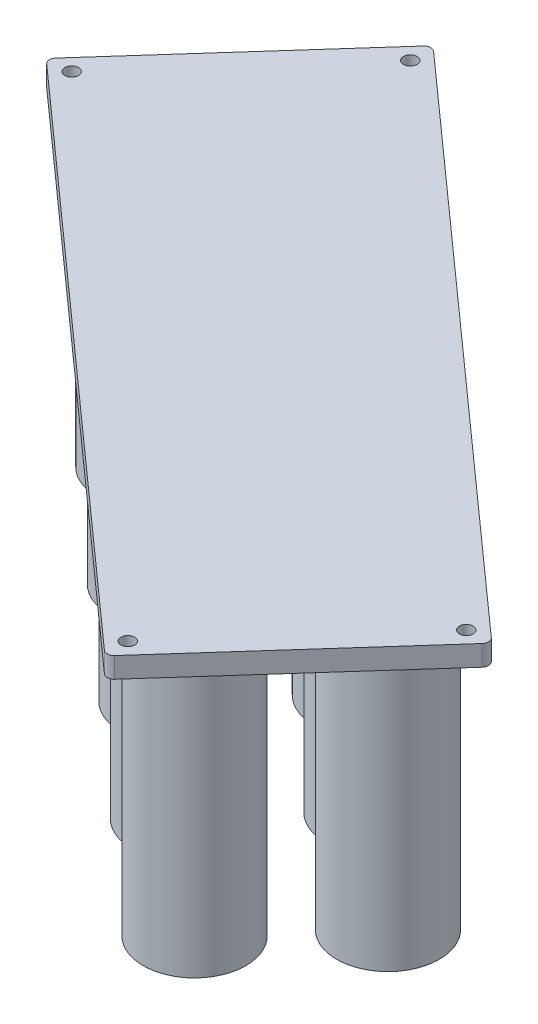
ISO-10303-21;
HEADER;
FILE_DESCRIPTION(('STEP AP214'),'2;1');
FILE_NAME('part.step','',(''),(''),'','','');
FILE_SCHEMA(('AUTOMOTIVE_DESIGN { 1 0 10303 214 1 1 1 1 }'));
ENDSEC;
DATA;
#1=APPLICATION_CONTEXT('core data for automotive mechanical design processes');
#2=APPLICATION_PROTOCOL_DEFINITION('international standard','automotive_design',2000,#1);
#3=PRODUCT_CONTEXT('',#1,'mechanical');
#4=PRODUCT('Part','Part','',(#3));
#5=PRODUCT_RELATED_PRODUCT_CATEGORY('part','',(#4));
#6=PRODUCT_DEFINITION_FORMATION('','',#4);
#7=PRODUCT_DEFINITION_CONTEXT('part definition',#1,'design');
#8=PRODUCT_DEFINITION('design','',#6,#7);
#9=PRODUCT_DEFINITION_SHAPE('','',#8);
#10=(LENGTH_UNIT() NAMED_UNIT(*) SI_UNIT(.MILLI.,.METRE.));
#11=(NAMED_UNIT(*) PLANE_ANGLE_UNIT() SI_UNIT($,.RADIAN.));
#12=(NAMED_UNIT(*) SI_UNIT($,.STERADIAN.) SOLID_ANGLE_UNIT());
#13=UNCERTAINTY_MEASURE_WITH_UNIT(LENGTH_MEASURE(1.E-05),#10,'distance_accuracy_value','');
#14=(GEOMETRIC_REPRESENTATION_CONTEXT(3) GLOBAL_UNCERTAINTY_ASSIGNED_CONTEXT((#13)) GLOBAL_UNIT_ASSIGNED_CONTEXT((#10,
#11,#12)) REPRESENTATION_CONTEXT('',''));
#15=CARTESIAN_POINT('',(0.,0.,0.));
#16=DIRECTION('',(0.,0.,1.));
#17=DIRECTION('',(1.,0.,0.));
#18=AXIS2_PLACEMENT_3D('',#15,#16,#17);
#19=CARTESIAN_POINT('',(43.2150354990466,-6.69382578946883,113.154126075941));
#20=DIRECTION('',(-0.665833640390477,0.,0.746100236780799));
#21=DIRECTION('',(0.746100236780799,0.,0.665833640390477));
#22=AXIS2_PLACEMENT_3D('',#19,#20,#21);
#23=PLANE('',#22);
#24=DIRECTION('',(-0.746100236780799,0.,-0.665833640390477));
#25=VECTOR('',#24,1.);
#26=CARTESIAN_POINT('',(43.2150354990466,-9.69382578946883,113.154126075941));
#27=LINE('',#26,#25);
#28=CARTESIAN_POINT('',(42.4689352622658,-9.69382578946883,112.48829243555));
#29=VERTEX_POINT('',#28);
#30=CARTESIAN_POINT('',(-35.8715895997181,-9.69382578946883,42.5757601945502));
#31=VERTEX_POINT('',#30);
#32=EDGE_CURVE('E168',#29,#31,#27,.T.);
#33=ORIENTED_EDGE('',*,*,#32,.F.);
#34=DIRECTION('',(0.,-1.,0.));
#35=VECTOR('',#34,1.);
#36=CARTESIAN_POINT('',(42.4689352622658,-6.69382578946883,112.48829243555));
#37=LINE('',#36,#35);
#38=CARTESIAN_POINT('',(42.4689352622658,-6.69382578946883,112.48829243555));
#39=VERTEX_POINT('',#38);
#40=EDGE_CURVE('E144',#29,#39,#37,.F.);
#41=ORIENTED_EDGE('',*,*,#40,.T.);
#42=DIRECTION('',(-0.746100236780799,0.,-0.665833640390477));
#43=VECTOR('',#42,1.);
#44=CARTESIAN_POINT('',(43.2150354990466,-6.69382578946883,113.154126075941));
#45=LINE('',#44,#43);
#46=CARTESIAN_POINT('',(-35.8715895997181,-6.69382578946883,42.5757601945502));
#47=VERTEX_POINT('',#46);
#48=EDGE_CURVE('E124',#39,#47,#45,.T.);
#49=ORIENTED_EDGE('',*,*,#48,.T.);
#50=DIRECTION('',(0.,-1.,0.));
#51=VECTOR('',#50,1.);
#52=CARTESIAN_POINT('',(-35.8715895997181,-6.69382578946883,42.5757601945502));
#53=LINE('',#52,#51);
#54=EDGE_CURVE('E141',#47,#31,#53,.T.);
#55=ORIENTED_EDGE('',*,*,#54,.T.);
#56=EDGE_LOOP('',(#33,#41,#49,#55));
#57=FACE_BOUND('',#56,.T.);
#58=ADVANCED_FACE('F37',(#57),#23,.T.);
#59=CARTESIAN_POINT('',(69.8483811146657,-6.69382578946883,83.3101166047088));
#60=DIRECTION('',(0.746100236780799,0.,0.665833640390477));
#61=DIRECTION('',(0.665833640390477,0.,-0.746100236780799));
#62=AXIS2_PLACEMENT_3D('',#59,#60,#61);
#63=PLANE('',#62);
#64=DIRECTION('',(-0.665833640390477,0.,0.746100236780799));
#65=VECTOR('',#64,1.);
#66=CARTESIAN_POINT('',(69.8483811146657,-6.69382578946883,83.3101166047088));
#67=LINE('',#66,#65);
#68=CARTESIAN_POINT('',(69.1825474742752,-6.69382578946883,84.0562168414896));
#69=VERTEX_POINT('',#68);
#70=CARTESIAN_POINT('',(43.8808691394371,-6.69382578946883,112.40802583916));
#71=VERTEX_POINT('',#70);
#72=EDGE_CURVE('E160',#69,#71,#67,.T.);
#73=ORIENTED_EDGE('',*,*,#72,.T.);
#74=DIRECTION('',(0.,-1.,0.));
#75=VECTOR('',#74,1.);
#76=CARTESIAN_POINT('',(43.8808691394371,-6.69382578946883,112.40802583916));
#77=LINE('',#76,#75);
#78=CARTESIAN_POINT('',(43.8808691394371,-9.69382578946883,112.40802583916));
#79=VERTEX_POINT('',#78);
#80=EDGE_CURVE('E123',#71,#79,#77,.T.);
#81=ORIENTED_EDGE('',*,*,#80,.T.);
#82=DIRECTION('',(-0.665833640390477,0.,0.746100236780799));
#83=VECTOR('',#82,1.);
#84=CARTESIAN_POINT('',(69.8483811146657,-9.69382578946883,83.3101166047088));
#85=LINE('',#84,#83);
#86=CARTESIAN_POINT('',(69.1825474742752,-9.69382578946883,84.0562168414896));
#87=VERTEX_POINT('',#86);
#88=EDGE_CURVE('E106',#87,#79,#85,.T.);
#89=ORIENTED_EDGE('',*,*,#88,.F.);
#90=DIRECTION('',(0.,-1.,0.));
#91=VECTOR('',#90,1.);
#92=CARTESIAN_POINT('',(69.1825474742752,-6.69382578946883,84.0562168414896));
#93=LINE('',#92,#91);
#94=EDGE_CURVE('E120',#87,#69,#93,.F.);
#95=ORIENTED_EDGE('',*,*,#94,.T.);
#96=EDGE_LOOP('',(#73,#81,#89,#95));
#97=FACE_BOUND('',#96,.T.);
#98=ADVANCED_FACE('F119',(#97),#63,.T.);
#99=CARTESIAN_POINT('',(-9.98434422087984,-6.69382578946883,12.0659170829278));
#100=DIRECTION('',(0.665833640390477,0.,-0.746100236780799));
#101=DIRECTION('',(-0.746100236780799,0.,-0.665833640390477));
#102=AXIS2_PLACEMENT_3D('',#99,#100,#101);
#103=PLANE('',#102);
#104=DIRECTION('',(0.746100236780799,0.,0.665833640390477));
#105=VECTOR('',#104,1.);
#106=CARTESIAN_POINT('',(-9.98434422087984,-6.69382578946883,12.0659170829278));
#107=LINE('',#106,#105);
#108=CARTESIAN_POINT('',(-9.23824398409904,-6.69382578946883,12.7317507233182));
#109=VERTEX_POINT('',#108);
#110=CARTESIAN_POINT('',(69.1022808778849,-6.69382578946883,82.6442829643183));
#111=VERTEX_POINT('',#110);
#112=EDGE_CURVE('E159',#109,#111,#107,.T.);
#113=ORIENTED_EDGE('',*,*,#112,.T.);
#114=DIRECTION('',(0.,-1.,0.));
#115=VECTOR('',#114,1.);
#116=CARTESIAN_POINT('',(69.1022808778849,-6.69382578946883,82.6442829643184));
#117=LINE('',#116,#115);
#118=CARTESIAN_POINT('',(69.1022808778849,-9.69382578946883,82.6442829643183));
#119=VERTEX_POINT('',#118);
#120=EDGE_CURVE('E154',#111,#119,#117,.T.);
#121=ORIENTED_EDGE('',*,*,#120,.T.);
#122=DIRECTION('',(0.746100236780799,0.,0.665833640390477));
#123=VECTOR('',#122,1.);
#124=CARTESIAN_POINT('',(-9.98434422087984,-9.69382578946883,12.0659170829278));
#125=LINE('',#124,#123);
#126=CARTESIAN_POINT('',(-9.23824398409904,-9.69382578946883,12.7317507233182));
#127=VERTEX_POINT('',#126);
#128=EDGE_CURVE('E108',#127,#119,#125,.T.);
#129=ORIENTED_EDGE('',*,*,#128,.F.);
#130=DIRECTION('',(0.,-1.,0.));
#131=VECTOR('',#130,1.);
#132=CARTESIAN_POINT('',(-9.23824398409904,-6.69382578946883,12.7317507233182));
#133=LINE('',#132,#131);
#134=EDGE_CURVE('E152',#127,#109,#133,.F.);
#135=ORIENTED_EDGE('',*,*,#134,.T.);
#136=EDGE_LOOP('',(#113,#121,#129,#135));
#137=FACE_BOUND('',#136,.T.);
#138=ADVANCED_FACE('F157',(#137),#103,.T.);
#139=CARTESIAN_POINT('',(-36.6176898364989,-6.69382578946883,41.9099265541598));
#140=DIRECTION('',(-0.746100236780799,0.,-0.665833640390477));
#141=DIRECTION('',(-0.665833640390477,0.,0.746100236780799));
#142=AXIS2_PLACEMENT_3D('',#139,#140,#141);
#143=PLANE('',#142);
#144=DIRECTION('',(0.665833640390477,0.,-0.746100236780799));
#145=VECTOR('',#144,1.);
#146=CARTESIAN_POINT('',(-36.6176898364989,-6.69382578946883,41.9099265541598));
#147=LINE('',#146,#145);
#148=CARTESIAN_POINT('',(-35.9518561961085,-6.69382578946883,41.1638263173789));
#149=VERTEX_POINT('',#148);
#150=CARTESIAN_POINT('',(-10.6501778612703,-6.69382578946883,12.8120173197086));
#151=VERTEX_POINT('',#150);
#152=EDGE_CURVE('E161',#149,#151,#147,.T.);
#153=ORIENTED_EDGE('',*,*,#152,.T.);
#154=DIRECTION('',(0.,-1.,0.));
#155=VECTOR('',#154,1.);
#156=CARTESIAN_POINT('',(-10.6501778612703,-6.69382578946883,12.8120173197086));
#157=LINE('',#156,#155);
#158=CARTESIAN_POINT('',(-10.6501778612703,-9.69382578946883,12.8120173197086));
#159=VERTEX_POINT('',#158);
#160=EDGE_CURVE('E11',#151,#159,#157,.T.);
#161=ORIENTED_EDGE('',*,*,#160,.T.);
#162=DIRECTION('',(0.665833640390477,0.,-0.746100236780799));
#163=VECTOR('',#162,1.);
#164=CARTESIAN_POINT('',(-36.6176898364989,-9.69382578946883,41.9099265541598));
#165=LINE('',#164,#163);
#166=CARTESIAN_POINT('',(-35.9518561961085,-9.69382578946883,41.1638263173789));
#167=VERTEX_POINT('',#166);
#168=EDGE_CURVE('E171',#167,#159,#165,.T.);
#169=ORIENTED_EDGE('',*,*,#168,.F.);
#170=DIRECTION('',(0.,-1.,0.));
#171=VECTOR('',#170,1.);
#172=CARTESIAN_POINT('',(-35.9518561961085,-6.69382578946883,41.1638263173789));
#173=LINE('',#172,#171);
#174=EDGE_CURVE('E45',#167,#149,#173,.F.);
#175=ORIENTED_EDGE('',*,*,#174,.T.);
#176=EDGE_LOOP('',(#153,#161,#169,#175));
#177=FACE_BOUND('',#176,.T.);
#178=ADVANCED_FACE('F294',(#177),#143,.T.);
#179=CARTESIAN_POINT('',(0.,-6.69382578946883,0.));
#180=DIRECTION('',(0.,-1.,0.));
#181=DIRECTION('',(0.,0.,-1.));
#182=AXIS2_PLACEMENT_3D('',#179,#180,#181);
#183=PLANE('',#182);
#184=CARTESIAN_POINT('',(43.0143690080708,-6.69382578946883,109.624291383013));
#185=DIRECTION('',(0.,-1.,0.));
#186=DIRECTION('',(0.,0.,-1.));
#187=AXIS2_PLACEMENT_3D('',#184,#185,#186);
#188=CIRCLE('',#187,0.999999999999994);
#189=CARTESIAN_POINT('',(43.0143690080708,-6.69382578946883,108.624291383013));
#190=VERTEX_POINT('',#189);
#191=EDGE_CURVE('E266',#190,#190,#188,.T.);
#192=ORIENTED_EDGE('',*,*,#191,.T.);
#193=EDGE_LOOP('',(#192));
#194=FACE_BOUND('',#193,.T.);
#195=CARTESIAN_POINT('',(-9.78367772990404,-6.69382578946883,15.595751775856));
#196=DIRECTION('',(0.,-1.,0.));
#197=DIRECTION('',(0.,0.,-1.));
#198=AXIS2_PLACEMENT_3D('',#195,#196,#197);
#199=CIRCLE('',#198,0.999999999999992);
#200=CARTESIAN_POINT('',(-9.78367772990404,-6.69382578946883,14.595751775856));
#201=VERTEX_POINT('',#200);
#202=EDGE_CURVE('E272',#201,#201,#199,.T.);
#203=ORIENTED_EDGE('',*,*,#202,.T.);
#204=EDGE_LOOP('',(#203));
#205=FACE_BOUND('',#204,.T.);
#206=CARTESIAN_POINT('',(-33.0878551435707,-6.69382578946883,41.7092600631839));
#207=DIRECTION('',(0.,-1.,0.));
#208=DIRECTION('',(0.,0.,-1.));
#209=AXIS2_PLACEMENT_3D('',#206,#207,#208);
#210=CIRCLE('',#209,0.999999999999994);
#211=CARTESIAN_POINT('',(-33.0878551435707,-6.69382578946883,40.7092600631839));
#212=VERTEX_POINT('',#211);
#213=EDGE_CURVE('E278',#212,#212,#210,.T.);
#214=ORIENTED_EDGE('',*,*,#213,.T.);
#215=EDGE_LOOP('',(#214));
#216=FACE_BOUND('',#215,.T.);
#217=CARTESIAN_POINT('',(66.3185464217375,-6.69382578946883,83.5107830956846));
#218=DIRECTION('',(0.,-1.,0.));
#219=DIRECTION('',(0.,0.,-1.));
#220=AXIS2_PLACEMENT_3D('',#217,#218,#219);
#221=CIRCLE('',#220,0.999999999999987);
#222=CARTESIAN_POINT('',(66.3185464217375,-6.69382578946883,82.5107830956846));
#223=VERTEX_POINT('',#222);
#224=EDGE_CURVE('E172',#223,#223,#221,.T.);
#225=ORIENTED_EDGE('',*,*,#224,.T.);
#226=EDGE_LOOP('',(#225));
#227=FACE_BOUND('',#226,.T.);
#228=ORIENTED_EDGE('',*,*,#48,.F.);
#229=CARTESIAN_POINT('',(43.1347689026563,-6.69382578946883,111.74219219877));
#230=DIRECTION('',(0.,-1.,0.));
#231=DIRECTION('',(0.,0.,-1.));
#232=AXIS2_PLACEMENT_3D('',#229,#230,#231);
#233=CIRCLE('',#232,1.);
#234=EDGE_CURVE('E150',#39,#71,#233,.F.);
#235=ORIENTED_EDGE('',*,*,#234,.T.);
#236=ORIENTED_EDGE('',*,*,#72,.F.);
#237=CARTESIAN_POINT('',(68.4364472374944,-6.69382578946883,83.3903832010992));
#238=DIRECTION('',(0.,-1.,0.));
#239=DIRECTION('',(0.,0.,-1.));
#240=AXIS2_PLACEMENT_3D('',#237,#238,#239);
#241=CIRCLE('',#240,1.);
#242=EDGE_CURVE('E128',#69,#111,#241,.F.);
#243=ORIENTED_EDGE('',*,*,#242,.T.);
#244=ORIENTED_EDGE('',*,*,#112,.F.);
#245=CARTESIAN_POINT('',(-9.90407762448952,-6.69382578946883,13.477850960099));
#246=DIRECTION('',(0.,-1.,0.));
#247=DIRECTION('',(0.,0.,-1.));
#248=AXIS2_PLACEMENT_3D('',#245,#246,#247);
#249=CIRCLE('',#248,1.);
#250=EDGE_CURVE('E52',#109,#151,#249,.F.);
#251=ORIENTED_EDGE('',*,*,#250,.T.);
#252=ORIENTED_EDGE('',*,*,#152,.F.);
#253=CARTESIAN_POINT('',(-35.2057559593277,-6.69382578946883,41.8296599577694));
#254=DIRECTION('',(0.,-1.,0.));
#255=DIRECTION('',(0.,0.,-1.));
#256=AXIS2_PLACEMENT_3D('',#253,#254,#255);
#257=CIRCLE('',#256,1.);
#258=EDGE_CURVE('E146',#149,#47,#257,.F.);
#259=ORIENTED_EDGE('',*,*,#258,.T.);
#260=EDGE_LOOP('',(#228,#235,#236,#243,#244,#251,#252,#259));
#261=FACE_BOUND('',#260,.T.);
#262=ADVANCED_FACE('F207',(#194,#205,#216,#227,#261),#183,.F.);
#263=CARTESIAN_POINT('',(0.,-9.69382578946883,0.));
#264=DIRECTION('',(0.,-1.,0.));
#265=DIRECTION('',(0.,0.,-1.));
#266=AXIS2_PLACEMENT_3D('',#263,#264,#265);
#267=PLANE('',#266);
#268=CARTESIAN_POINT('',(43.0143690080708,-9.69382578946884,109.624291383013));
#269=DIRECTION('',(0.,-1.,0.));
#270=DIRECTION('',(0.,0.,-1.));
#271=AXIS2_PLACEMENT_3D('',#268,#269,#270);
#272=CIRCLE('',#271,0.999999999999994);
#273=CARTESIAN_POINT('',(43.0143690080708,-9.69382578946884,108.624291383013));
#274=VERTEX_POINT('',#273);
#275=EDGE_CURVE('E263',#274,#274,#272,.T.);
#276=ORIENTED_EDGE('',*,*,#275,.F.);
#277=EDGE_LOOP('',(#276));
#278=FACE_BOUND('',#277,.T.);
#279=CARTESIAN_POINT('',(-9.78367772990404,-9.69382578946884,15.595751775856));
#280=DIRECTION('',(0.,-1.,0.));
#281=DIRECTION('',(0.,0.,-1.));
#282=AXIS2_PLACEMENT_3D('',#279,#280,#281);
#283=CIRCLE('',#282,0.999999999999994);
#284=CARTESIAN_POINT('',(-9.78367772990404,-9.69382578946884,14.595751775856));
#285=VERTEX_POINT('',#284);
#286=EDGE_CURVE('E269',#285,#285,#283,.T.);
#287=ORIENTED_EDGE('',*,*,#286,.F.);
#288=EDGE_LOOP('',(#287));
#289=FACE_BOUND('',#288,.T.);
#290=CARTESIAN_POINT('',(-33.0878551435707,-9.69382578946884,41.7092600631839));
#291=DIRECTION('',(0.,-1.,0.));
#292=DIRECTION('',(0.,0.,-1.));
#293=AXIS2_PLACEMENT_3D('',#290,#291,#292);
#294=CIRCLE('',#293,0.999999999999994);
#295=CARTESIAN_POINT('',(-33.0878551435707,-9.69382578946884,40.7092600631839));
#296=VERTEX_POINT('',#295);
#297=EDGE_CURVE('E275',#296,#296,#294,.T.);
#298=ORIENTED_EDGE('',*,*,#297,.F.);
#299=EDGE_LOOP('',(#298));
#300=FACE_BOUND('',#299,.T.);
#301=CARTESIAN_POINT('',(66.3185464217375,-9.69382578946884,83.5107830956846));
#302=DIRECTION('',(0.,-1.,0.));
#303=DIRECTION('',(0.,0.,-1.));
#304=AXIS2_PLACEMENT_3D('',#301,#302,#303);
#305=CIRCLE('',#304,0.999999999999987);
#306=CARTESIAN_POINT('',(66.3185464217375,-9.69382578946884,82.5107830956846));
#307=VERTEX_POINT('',#306);
#308=EDGE_CURVE('E281',#307,#307,#305,.T.);
#309=ORIENTED_EDGE('',*,*,#308,.F.);
#310=EDGE_LOOP('',(#309));
#311=FACE_BOUND('',#310,.T.);
#312=CARTESIAN_POINT('',(-9.18167825697663,-9.69382578946883,26.1852558546405));
#313=DIRECTION('',(0.,-1.,0.));
#314=DIRECTION('',(0.,0.,-1.));
#315=AXIS2_PLACEMENT_3D('',#312,#313,#314);
#316=CIRCLE('',#315,7.49999999999999);
#317=CARTESIAN_POINT('',(-9.18167825697663,-9.69382578946883,18.6852558546406));
#318=VERTEX_POINT('',#317);
#319=EDGE_CURVE('E129',#318,#318,#316,.T.);
#320=ORIENTED_EDGE('',*,*,#319,.F.);
#321=EDGE_LOOP('',(#320));
#322=FACE_BOUND('',#321,.T.);
#323=CARTESIAN_POINT('',(6.48642671542016,-9.69382578946883,40.1677623028406));
#324=DIRECTION('',(0.,-1.,0.));
#325=DIRECTION('',(0.,0.,-1.));
#326=AXIS2_PLACEMENT_3D('',#323,#324,#325);
#327=CIRCLE('',#326,7.49999999999999);
#328=CARTESIAN_POINT('',(6.48642671542016,-9.69382578946883,32.6677623028406));
#329=VERTEX_POINT('',#328);
#330=EDGE_CURVE('E134',#329,#329,#327,.T.);
#331=ORIENTED_EDGE('',*,*,#330,.F.);
#332=EDGE_LOOP('',(#331));
#333=FACE_BOUND('',#332,.T.);
#334=CARTESIAN_POINT('',(22.1545316878169,-9.69382578946883,54.1502687510406));
#335=DIRECTION('',(0.,-1.,0.));
#336=DIRECTION('',(0.,0.,-1.));
#337=AXIS2_PLACEMENT_3D('',#334,#335,#336);
#338=CIRCLE('',#337,7.5);
#339=CARTESIAN_POINT('',(22.1545316878169,-9.69382578946883,46.6502687510406));
#340=VERTEX_POINT('',#339);
#341=EDGE_CURVE('E196',#340,#340,#338,.T.);
#342=ORIENTED_EDGE('',*,*,#341,.F.);
#343=EDGE_LOOP('',(#342));
#344=FACE_BOUND('',#343,.T.);
#345=CARTESIAN_POINT('',(-22.4983510647862,-9.69382578946883,41.1072605902565));
#346=DIRECTION('',(0.,-1.,0.));
#347=DIRECTION('',(0.,0.,-1.));
#348=AXIS2_PLACEMENT_3D('',#345,#346,#347);
#349=CIRCLE('',#348,7.49999999999999);
#350=CARTESIAN_POINT('',(-22.4983510647862,-9.69382578946883,33.6072605902565));
#351=VERTEX_POINT('',#350);
#352=EDGE_CURVE('E193',#351,#351,#349,.T.);
#353=ORIENTED_EDGE('',*,*,#352,.F.);
#354=EDGE_LOOP('',(#353));
#355=FACE_BOUND('',#354,.T.);
#356=CARTESIAN_POINT('',(-6.83024609238938,-9.69382578946883,55.0897670384565));
#357=DIRECTION('',(0.,-1.,0.));
#358=DIRECTION('',(0.,0.,-1.));
#359=AXIS2_PLACEMENT_3D('',#356,#357,#358);
#360=CIRCLE('',#359,7.49999999999999);
#361=CARTESIAN_POINT('',(-6.83024609238938,-9.69382578946883,47.5897670384566));
#362=VERTEX_POINT('',#361);
#363=EDGE_CURVE('E190',#362,#362,#360,.T.);
#364=ORIENTED_EDGE('',*,*,#363,.F.);
#365=EDGE_LOOP('',(#364));
#366=FACE_BOUND('',#365,.T.);
#367=CARTESIAN_POINT('',(8.8378588800074,-9.69382578946883,69.0722734866566));
#368=DIRECTION('',(0.,-1.,0.));
#369=DIRECTION('',(0.,0.,-1.));
#370=AXIS2_PLACEMENT_3D('',#367,#368,#369);
#371=CIRCLE('',#370,7.5);
#372=CARTESIAN_POINT('',(8.8378588800074,-9.69382578946883,61.5722734866566));
#373=VERTEX_POINT('',#372);
#374=EDGE_CURVE('E187',#373,#373,#371,.T.);
#375=ORIENTED_EDGE('',*,*,#374,.F.);
#376=EDGE_LOOP('',(#375));
#377=FACE_BOUND('',#376,.T.);
#378=CARTESIAN_POINT('',(53.4907416326105,-9.69382578946883,82.1152816474406));
#379=DIRECTION('',(0.,-1.,0.));
#380=DIRECTION('',(0.,0.,-1.));
#381=AXIS2_PLACEMENT_3D('',#378,#379,#380);
#382=CIRCLE('',#381,7.5);
#383=CARTESIAN_POINT('',(53.4907416326105,-9.69382578946883,74.6152816474406));
#384=VERTEX_POINT('',#383);
#385=EDGE_CURVE('E184',#384,#384,#382,.T.);
#386=ORIENTED_EDGE('',*,*,#385,.F.);
#387=EDGE_LOOP('',(#386));
#388=FACE_BOUND('',#387,.T.);
#389=CARTESIAN_POINT('',(40.174068824801,-9.69382578946883,97.0372863830566));
#390=DIRECTION('',(0.,-1.,0.));
#391=DIRECTION('',(0.,0.,-1.));
#392=AXIS2_PLACEMENT_3D('',#389,#390,#391);
#393=CIRCLE('',#392,7.5);
#394=CARTESIAN_POINT('',(40.174068824801,-9.69382578946883,89.5372863830566));
#395=VERTEX_POINT('',#394);
#396=EDGE_CURVE('E181',#395,#395,#393,.T.);
#397=ORIENTED_EDGE('',*,*,#396,.F.);
#398=EDGE_LOOP('',(#397));
#399=FACE_BOUND('',#398,.T.);
#400=CARTESIAN_POINT('',(24.5059638524042,-9.69382578946883,83.0547799348566));
#401=DIRECTION('',(0.,-1.,0.));
#402=DIRECTION('',(0.,0.,-1.));
#403=AXIS2_PLACEMENT_3D('',#400,#401,#402);
#404=CIRCLE('',#403,7.5);
#405=CARTESIAN_POINT('',(24.5059638524042,-9.69382578946883,75.5547799348566));
#406=VERTEX_POINT('',#405);
#407=EDGE_CURVE('E178',#406,#406,#404,.T.);
#408=ORIENTED_EDGE('',*,*,#407,.F.);
#409=EDGE_LOOP('',(#408));
#410=FACE_BOUND('',#409,.T.);
#411=CARTESIAN_POINT('',(37.8226366602137,-9.69382578946883,68.1327751992406));
#412=DIRECTION('',(0.,-1.,0.));
#413=DIRECTION('',(0.,0.,-1.));
#414=AXIS2_PLACEMENT_3D('',#411,#412,#413);
#415=CIRCLE('',#414,7.5);
#416=CARTESIAN_POINT('',(37.8226366602137,-9.69382578946883,60.6327751992406));
#417=VERTEX_POINT('',#416);
#418=EDGE_CURVE('E163',#417,#417,#415,.T.);
#419=ORIENTED_EDGE('',*,*,#418,.F.);
#420=EDGE_LOOP('',(#419));
#421=FACE_BOUND('',#420,.T.);
#422=ORIENTED_EDGE('',*,*,#88,.T.);
#423=CARTESIAN_POINT('',(43.1347689026563,-9.69382578946883,111.74219219877));
#424=DIRECTION('',(0.,-1.,0.));
#425=DIRECTION('',(0.,0.,-1.));
#426=AXIS2_PLACEMENT_3D('',#423,#424,#425);
#427=CIRCLE('',#426,1.);
#428=EDGE_CURVE('E113',#79,#29,#427,.T.);
#429=ORIENTED_EDGE('',*,*,#428,.T.);
#430=ORIENTED_EDGE('',*,*,#32,.T.);
#431=CARTESIAN_POINT('',(-35.2057559593277,-9.69382578946883,41.8296599577694));
#432=DIRECTION('',(0.,-1.,0.));
#433=DIRECTION('',(0.,0.,-1.));
#434=AXIS2_PLACEMENT_3D('',#431,#432,#433);
#435=CIRCLE('',#434,1.);
#436=EDGE_CURVE('E131',#31,#167,#435,.T.);
#437=ORIENTED_EDGE('',*,*,#436,.T.);
#438=ORIENTED_EDGE('',*,*,#168,.T.);
#439=CARTESIAN_POINT('',(-9.90407762448952,-9.69382578946883,13.477850960099));
#440=DIRECTION('',(0.,-1.,0.));
#441=DIRECTION('',(0.,0.,-1.));
#442=AXIS2_PLACEMENT_3D('',#439,#440,#441);
#443=CIRCLE('',#442,1.);
#444=EDGE_CURVE('E114',#159,#127,#443,.T.);
#445=ORIENTED_EDGE('',*,*,#444,.T.);
#446=ORIENTED_EDGE('',*,*,#128,.T.);
#447=CARTESIAN_POINT('',(68.4364472374944,-9.69382578946883,83.3903832010992));
#448=DIRECTION('',(0.,-1.,0.));
#449=DIRECTION('',(0.,0.,-1.));
#450=AXIS2_PLACEMENT_3D('',#447,#448,#449);
#451=CIRCLE('',#450,1.);
#452=EDGE_CURVE('E103',#119,#87,#451,.T.);
#453=ORIENTED_EDGE('',*,*,#452,.T.);
#454=EDGE_LOOP('',(#422,#429,#430,#437,#438,#445,#446,#453));
#455=FACE_BOUND('',#454,.T.);
#456=ADVANCED_FACE('F105',(#278,#289,#300,#311,#322,#333,#344,#355,#366,#377,#388,#399,#410,
#421,#455),#267,.T.);
#457=CARTESIAN_POINT('',(37.8226366602137,-39.6938257894688,68.1327751992406));
#458=DIRECTION('',(0.,1.,0.));
#459=DIRECTION('',(0.,0.,1.));
#460=AXIS2_PLACEMENT_3D('',#457,#458,#459);
#461=CYLINDRICAL_SURFACE('',#460,7.5);
#462=ORIENTED_EDGE('',*,*,#418,.T.);
#463=EDGE_LOOP('',(#462));
#464=FACE_BOUND('',#463,.T.);
#465=CARTESIAN_POINT('',(37.8226366602137,-51.6938257894688,68.1327751992406));
#466=DIRECTION('',(0.,-1.,0.));
#467=DIRECTION('',(0.,0.,-1.));
#468=AXIS2_PLACEMENT_3D('',#465,#466,#467);
#469=CIRCLE('',#468,7.5);
#470=CARTESIAN_POINT('',(37.8226366602137,-51.6938257894688,60.6327751992406));
#471=VERTEX_POINT('',#470);
#472=EDGE_CURVE('E232',#471,#471,#469,.T.);
#473=ORIENTED_EDGE('',*,*,#472,.F.);
#474=EDGE_LOOP('',(#473));
#475=FACE_BOUND('',#474,.T.);
#476=ADVANCED_FACE('F206',(#464,#475),#461,.T.);
#477=CARTESIAN_POINT('',(24.5059638524042,-39.6938257894688,83.0547799348566));
#478=DIRECTION('',(0.,1.,0.));
#479=DIRECTION('',(0.,0.,1.));
#480=AXIS2_PLACEMENT_3D('',#477,#478,#479);
#481=CYLINDRICAL_SURFACE('',#480,7.5);
#482=ORIENTED_EDGE('',*,*,#407,.T.);
#483=EDGE_LOOP('',(#482));
#484=FACE_BOUND('',#483,.T.);
#485=CARTESIAN_POINT('',(24.5059638524042,-51.6938257894688,83.0547799348566));
#486=DIRECTION('',(0.,-1.,0.));
#487=DIRECTION('',(0.,0.,-1.));
#488=AXIS2_PLACEMENT_3D('',#485,#486,#487);
#489=CIRCLE('',#488,7.5);
#490=CARTESIAN_POINT('',(24.5059638524042,-51.6938257894688,75.5547799348566));
#491=VERTEX_POINT('',#490);
#492=EDGE_CURVE('E257',#491,#491,#489,.T.);
#493=ORIENTED_EDGE('',*,*,#492,.F.);
#494=EDGE_LOOP('',(#493));
#495=FACE_BOUND('',#494,.T.);
#496=ADVANCED_FACE('F228',(#484,#495),#481,.T.);
#497=CARTESIAN_POINT('',(40.174068824801,-39.6938257894688,97.0372863830566));
#498=DIRECTION('',(0.,1.,0.));
#499=DIRECTION('',(0.,0.,1.));
#500=AXIS2_PLACEMENT_3D('',#497,#498,#499);
#501=CYLINDRICAL_SURFACE('',#500,7.5);
#502=ORIENTED_EDGE('',*,*,#396,.T.);
#503=EDGE_LOOP('',(#502));
#504=FACE_BOUND('',#503,.T.);
#505=CARTESIAN_POINT('',(40.174068824801,-51.6938257894688,97.0372863830566));
#506=DIRECTION('',(0.,-1.,0.));
#507=DIRECTION('',(0.,0.,-1.));
#508=AXIS2_PLACEMENT_3D('',#505,#506,#507);
#509=CIRCLE('',#508,7.5);
#510=CARTESIAN_POINT('',(40.174068824801,-51.6938257894688,89.5372863830566));
#511=VERTEX_POINT('',#510);
#512=EDGE_CURVE('E260',#511,#511,#509,.T.);
#513=ORIENTED_EDGE('',*,*,#512,.F.);
#514=EDGE_LOOP('',(#513));
#515=FACE_BOUND('',#514,.T.);
#516=ADVANCED_FACE('F389',(#504,#515),#501,.T.);
#517=CARTESIAN_POINT('',(53.4907416326105,-39.6938257894688,82.1152816474406));
#518=DIRECTION('',(0.,1.,0.));
#519=DIRECTION('',(0.,0.,1.));
#520=AXIS2_PLACEMENT_3D('',#517,#518,#519);
#521=CYLINDRICAL_SURFACE('',#520,7.5);
#522=ORIENTED_EDGE('',*,*,#385,.T.);
#523=EDGE_LOOP('',(#522));
#524=FACE_BOUND('',#523,.T.);
#525=CARTESIAN_POINT('',(53.4907416326105,-51.6938257894688,82.1152816474406));
#526=DIRECTION('',(0.,-1.,0.));
#527=DIRECTION('',(0.,0.,-1.));
#528=AXIS2_PLACEMENT_3D('',#525,#526,#527);
#529=CIRCLE('',#528,7.5);
#530=CARTESIAN_POINT('',(53.4907416326105,-51.6938257894688,74.6152816474406));
#531=VERTEX_POINT('',#530);
#532=EDGE_CURVE('E235',#531,#531,#529,.T.);
#533=ORIENTED_EDGE('',*,*,#532,.F.);
#534=EDGE_LOOP('',(#533));
#535=FACE_BOUND('',#534,.T.);
#536=ADVANCED_FACE('F399',(#524,#535),#521,.T.);
#537=CARTESIAN_POINT('',(8.8378588800074,-39.6938257894688,69.0722734866566));
#538=DIRECTION('',(0.,1.,0.));
#539=DIRECTION('',(0.,0.,1.));
#540=AXIS2_PLACEMENT_3D('',#537,#538,#539);
#541=CYLINDRICAL_SURFACE('',#540,7.5);
#542=ORIENTED_EDGE('',*,*,#374,.T.);
#543=EDGE_LOOP('',(#542));
#544=FACE_BOUND('',#543,.T.);
#545=CARTESIAN_POINT('',(8.8378588800074,-51.6938257894688,69.0722734866566));
#546=DIRECTION('',(0.,-1.,0.));
#547=DIRECTION('',(0.,0.,-1.));
#548=AXIS2_PLACEMENT_3D('',#545,#546,#547);
#549=CIRCLE('',#548,7.5);
#550=CARTESIAN_POINT('',(8.8378588800074,-51.6938257894688,61.5722734866566));
#551=VERTEX_POINT('',#550);
#552=EDGE_CURVE('E254',#551,#551,#549,.T.);
#553=ORIENTED_EDGE('',*,*,#552,.F.);
#554=EDGE_LOOP('',(#553));
#555=FACE_BOUND('',#554,.T.);
#556=ADVANCED_FACE('F410',(#544,#555),#541,.T.);
#557=CARTESIAN_POINT('',(-6.83024609238938,-39.6938257894688,55.0897670384565));
#558=DIRECTION('',(0.,1.,0.));
#559=DIRECTION('',(0.,0.,1.));
#560=AXIS2_PLACEMENT_3D('',#557,#558,#559);
#561=CYLINDRICAL_SURFACE('',#560,7.49999999999999);
#562=ORIENTED_EDGE('',*,*,#363,.T.);
#563=EDGE_LOOP('',(#562));
#564=FACE_BOUND('',#563,.T.);
#565=CARTESIAN_POINT('',(-6.83024609238938,-51.6938257894688,55.0897670384565));
#566=DIRECTION('',(0.,-1.,0.));
#567=DIRECTION('',(0.,0.,-1.));
#568=AXIS2_PLACEMENT_3D('',#565,#566,#567);
#569=CIRCLE('',#568,7.5);
#570=CARTESIAN_POINT('',(-6.83024609238938,-51.6938257894688,47.5897670384565));
#571=VERTEX_POINT('',#570);
#572=EDGE_CURVE('E251',#571,#571,#569,.T.);
#573=ORIENTED_EDGE('',*,*,#572,.F.);
#574=EDGE_LOOP('',(#573));
#575=FACE_BOUND('',#574,.T.);
#576=ADVANCED_FACE('F421',(#564,#575),#561,.T.);
#577=CARTESIAN_POINT('',(-22.4983510647862,-39.6938257894688,41.1072605902565));
#578=DIRECTION('',(0.,1.,0.));
#579=DIRECTION('',(0.,0.,1.));
#580=AXIS2_PLACEMENT_3D('',#577,#578,#579);
#581=CYLINDRICAL_SURFACE('',#580,7.49999999999999);
#582=ORIENTED_EDGE('',*,*,#352,.T.);
#583=EDGE_LOOP('',(#582));
#584=FACE_BOUND('',#583,.T.);
#585=CARTESIAN_POINT('',(-22.4983510647862,-51.6938257894688,41.1072605902565));
#586=DIRECTION('',(0.,-1.,0.));
#587=DIRECTION('',(0.,0.,-1.));
#588=AXIS2_PLACEMENT_3D('',#585,#586,#587);
#589=CIRCLE('',#588,7.5);
#590=CARTESIAN_POINT('',(-22.4983510647862,-51.6938257894688,33.6072605902565));
#591=VERTEX_POINT('',#590);
#592=EDGE_CURVE('E248',#591,#591,#589,.T.);
#593=ORIENTED_EDGE('',*,*,#592,.F.);
#594=EDGE_LOOP('',(#593));
#595=FACE_BOUND('',#594,.T.);
#596=ADVANCED_FACE('F432',(#584,#595),#581,.T.);
#597=CARTESIAN_POINT('',(22.1545316878169,-39.6938257894688,54.1502687510406));
#598=DIRECTION('',(0.,1.,0.));
#599=DIRECTION('',(0.,0.,1.));
#600=AXIS2_PLACEMENT_3D('',#597,#598,#599);
#601=CYLINDRICAL_SURFACE('',#600,7.5);
#602=ORIENTED_EDGE('',*,*,#341,.T.);
#603=EDGE_LOOP('',(#602));
#604=FACE_BOUND('',#603,.T.);
#605=CARTESIAN_POINT('',(22.1545316878169,-51.6938257894688,54.1502687510406));
#606=DIRECTION('',(0.,-1.,0.));
#607=DIRECTION('',(0.,0.,-1.));
#608=AXIS2_PLACEMENT_3D('',#605,#606,#607);
#609=CIRCLE('',#608,7.5);
#610=CARTESIAN_POINT('',(22.1545316878169,-51.6938257894688,46.6502687510406));
#611=VERTEX_POINT('',#610);
#612=EDGE_CURVE('E234',#611,#611,#609,.T.);
#613=ORIENTED_EDGE('',*,*,#612,.F.);
#614=EDGE_LOOP('',(#613));
#615=FACE_BOUND('',#614,.T.);
#616=ADVANCED_FACE('F443',(#604,#615),#601,.T.);
#617=CARTESIAN_POINT('',(6.48642671542016,-39.6938257894688,40.1677623028406));
#618=DIRECTION('',(0.,1.,0.));
#619=DIRECTION('',(0.,0.,1.));
#620=AXIS2_PLACEMENT_3D('',#617,#618,#619);
#621=CYLINDRICAL_SURFACE('',#620,7.49999999999999);
#622=ORIENTED_EDGE('',*,*,#330,.T.);
#623=EDGE_LOOP('',(#622));
#624=FACE_BOUND('',#623,.T.);
#625=CARTESIAN_POINT('',(6.48642671542016,-51.6938257894688,40.1677623028406));
#626=DIRECTION('',(0.,-1.,0.));
#627=DIRECTION('',(0.,0.,-1.));
#628=AXIS2_PLACEMENT_3D('',#625,#626,#627);
#629=CIRCLE('',#628,7.5);
#630=CARTESIAN_POINT('',(6.48642671542016,-51.6938257894688,32.6677623028406));
#631=VERTEX_POINT('',#630);
#632=EDGE_CURVE('E238',#631,#631,#629,.T.);
#633=ORIENTED_EDGE('',*,*,#632,.F.);
#634=EDGE_LOOP('',(#633));
#635=FACE_BOUND('',#634,.T.);
#636=ADVANCED_FACE('F201',(#624,#635),#621,.T.);
#637=CARTESIAN_POINT('',(-9.18167825697663,-39.6938257894688,26.1852558546405));
#638=DIRECTION('',(0.,1.,0.));
#639=DIRECTION('',(0.,0.,1.));
#640=AXIS2_PLACEMENT_3D('',#637,#638,#639);
#641=CYLINDRICAL_SURFACE('',#640,7.49999999999999);
#642=ORIENTED_EDGE('',*,*,#319,.T.);
#643=EDGE_LOOP('',(#642));
#644=FACE_BOUND('',#643,.T.);
#645=CARTESIAN_POINT('',(-9.18167825697663,-51.6938257894688,26.1852558546405));
#646=DIRECTION('',(0.,-1.,0.));
#647=DIRECTION('',(0.,0.,-1.));
#648=AXIS2_PLACEMENT_3D('',#645,#646,#647);
#649=CIRCLE('',#648,7.5);
#650=CARTESIAN_POINT('',(-9.18167825697663,-51.6938257894688,18.6852558546405));
#651=VERTEX_POINT('',#650);
#652=EDGE_CURVE('E245',#651,#651,#649,.T.);
#653=ORIENTED_EDGE('',*,*,#652,.F.);
#654=EDGE_LOOP('',(#653));
#655=FACE_BOUND('',#654,.T.);
#656=ADVANCED_FACE('F464',(#644,#655),#641,.T.);
#657=CARTESIAN_POINT('',(66.3185464217375,-9.69382578946883,83.5107830956846));
#658=DIRECTION('',(0.,-1.,0.));
#659=DIRECTION('',(0.,0.,-1.));
#660=AXIS2_PLACEMENT_3D('',#657,#658,#659);
#661=CYLINDRICAL_SURFACE('',#660,0.999999999999987);
#662=ORIENTED_EDGE('',*,*,#224,.F.);
#663=EDGE_LOOP('',(#662));
#664=FACE_BOUND('',#663,.T.);
#665=ORIENTED_EDGE('',*,*,#308,.T.);
#666=EDGE_LOOP('',(#665));
#667=FACE_BOUND('',#666,.T.);
#668=ADVANCED_FACE('F474',(#664,#667),#661,.F.);
#669=CARTESIAN_POINT('',(-33.0878551435707,-9.69382578946883,41.7092600631839));
#670=DIRECTION('',(0.,-1.,0.));
#671=DIRECTION('',(0.,0.,-1.));
#672=AXIS2_PLACEMENT_3D('',#669,#670,#671);
#673=CYLINDRICAL_SURFACE('',#672,0.999999999999994);
#674=ORIENTED_EDGE('',*,*,#213,.F.);
#675=EDGE_LOOP('',(#674));
#676=FACE_BOUND('',#675,.T.);
#677=ORIENTED_EDGE('',*,*,#297,.T.);
#678=EDGE_LOOP('',(#677));
#679=FACE_BOUND('',#678,.T.);
#680=ADVANCED_FACE('F581',(#676,#679),#673,.F.);
#681=CARTESIAN_POINT('',(-9.78367772990404,-9.69382578946883,15.595751775856));
#682=DIRECTION('',(0.,-1.,0.));
#683=DIRECTION('',(0.,0.,-1.));
#684=AXIS2_PLACEMENT_3D('',#681,#682,#683);
#685=CYLINDRICAL_SURFACE('',#684,0.999999999999993);
#686=ORIENTED_EDGE('',*,*,#202,.F.);
#687=EDGE_LOOP('',(#686));
#688=FACE_BOUND('',#687,.T.);
#689=ORIENTED_EDGE('',*,*,#286,.T.);
#690=EDGE_LOOP('',(#689));
#691=FACE_BOUND('',#690,.T.);
#692=ADVANCED_FACE('F321',(#688,#691),#685,.F.);
#693=CARTESIAN_POINT('',(43.0143690080708,-9.69382578946883,109.624291383013));
#694=DIRECTION('',(0.,-1.,0.));
#695=DIRECTION('',(0.,0.,-1.));
#696=AXIS2_PLACEMENT_3D('',#693,#694,#695);
#697=CYLINDRICAL_SURFACE('',#696,0.999999999999994);
#698=ORIENTED_EDGE('',*,*,#191,.F.);
#699=EDGE_LOOP('',(#698));
#700=FACE_BOUND('',#699,.T.);
#701=ORIENTED_EDGE('',*,*,#275,.T.);
#702=EDGE_LOOP('',(#701));
#703=FACE_BOUND('',#702,.T.);
#704=ADVANCED_FACE('F316',(#700,#703),#697,.F.);
#705=CARTESIAN_POINT('',(43.1347689026563,-6.69382578946883,111.74219219877));
#706=DIRECTION('',(0.,-1.,0.));
#707=DIRECTION('',(0.,0.,-1.));
#708=AXIS2_PLACEMENT_3D('',#705,#706,#707);
#709=CYLINDRICAL_SURFACE('',#708,1.);
#710=ORIENTED_EDGE('',*,*,#234,.F.);
#711=ORIENTED_EDGE('',*,*,#40,.F.);
#712=ORIENTED_EDGE('',*,*,#428,.F.);
#713=ORIENTED_EDGE('',*,*,#80,.F.);
#714=EDGE_LOOP('',(#710,#711,#712,#713));
#715=FACE_BOUND('',#714,.T.);
#716=ADVANCED_FACE('F304',(#715),#709,.T.);
#717=CARTESIAN_POINT('',(68.4364472374944,-6.69382578946883,83.3903832010992));
#718=DIRECTION('',(0.,-1.,0.));
#719=DIRECTION('',(0.,0.,-1.));
#720=AXIS2_PLACEMENT_3D('',#717,#718,#719);
#721=CYLINDRICAL_SURFACE('',#720,1.);
#722=ORIENTED_EDGE('',*,*,#242,.F.);
#723=ORIENTED_EDGE('',*,*,#94,.F.);
#724=ORIENTED_EDGE('',*,*,#452,.F.);
#725=ORIENTED_EDGE('',*,*,#120,.F.);
#726=EDGE_LOOP('',(#722,#723,#724,#725));
#727=FACE_BOUND('',#726,.T.);
#728=ADVANCED_FACE('F127',(#727),#721,.T.);
#729=CARTESIAN_POINT('',(-9.90407762448952,-6.69382578946883,13.477850960099));
#730=DIRECTION('',(0.,-1.,0.));
#731=DIRECTION('',(0.,0.,-1.));
#732=AXIS2_PLACEMENT_3D('',#729,#730,#731);
#733=CYLINDRICAL_SURFACE('',#732,1.);
#734=ORIENTED_EDGE('',*,*,#250,.F.);
#735=ORIENTED_EDGE('',*,*,#134,.F.);
#736=ORIENTED_EDGE('',*,*,#444,.F.);
#737=ORIENTED_EDGE('',*,*,#160,.F.);
#738=EDGE_LOOP('',(#734,#735,#736,#737));
#739=FACE_BOUND('',#738,.T.);
#740=ADVANCED_FACE('F297',(#739),#733,.T.);
#741=CARTESIAN_POINT('',(-35.2057559593277,-6.69382578946883,41.8296599577694));
#742=DIRECTION('',(0.,-1.,0.));
#743=DIRECTION('',(0.,0.,-1.));
#744=AXIS2_PLACEMENT_3D('',#741,#742,#743);
#745=CYLINDRICAL_SURFACE('',#744,1.);
#746=ORIENTED_EDGE('',*,*,#258,.F.);
#747=ORIENTED_EDGE('',*,*,#174,.F.);
#748=ORIENTED_EDGE('',*,*,#436,.F.);
#749=ORIENTED_EDGE('',*,*,#54,.F.);
#750=EDGE_LOOP('',(#746,#747,#748,#749));
#751=FACE_BOUND('',#750,.T.);
#752=ADVANCED_FACE('F39',(#751),#745,.T.);
#753=CARTESIAN_POINT('',(40.174068824801,-51.6938257894688,97.0372863830566));
#754=DIRECTION('',(0.,-1.,0.));
#755=DIRECTION('',(0.,0.,-1.));
#756=AXIS2_PLACEMENT_3D('',#753,#754,#755);
#757=PLANE('',#756);
#758=ORIENTED_EDGE('',*,*,#512,.T.);
#759=EDGE_LOOP('',(#758));
#760=FACE_BOUND('',#759,.T.);
#761=ADVANCED_FACE('F303',(#760),#757,.T.);
#762=CARTESIAN_POINT('',(24.5059638524042,-51.6938257894688,83.0547799348566));
#763=DIRECTION('',(0.,-1.,0.));
#764=DIRECTION('',(0.,0.,-1.));
#765=AXIS2_PLACEMENT_3D('',#762,#763,#764);
#766=PLANE('',#765);
#767=ORIENTED_EDGE('',*,*,#492,.T.);
#768=EDGE_LOOP('',(#767));
#769=FACE_BOUND('',#768,.T.);
#770=ADVANCED_FACE('F485',(#769),#766,.T.);
#771=CARTESIAN_POINT('',(8.8378588800074,-51.6938257894688,69.0722734866566));
#772=DIRECTION('',(0.,-1.,0.));
#773=DIRECTION('',(0.,0.,-1.));
#774=AXIS2_PLACEMENT_3D('',#771,#772,#773);
#775=PLANE('',#774);
#776=ORIENTED_EDGE('',*,*,#552,.T.);
#777=EDGE_LOOP('',(#776));
#778=FACE_BOUND('',#777,.T.);
#779=ADVANCED_FACE('F495',(#778),#775,.T.);
#780=CARTESIAN_POINT('',(-6.83024609238938,-51.6938257894688,55.0897670384565));
#781=DIRECTION('',(0.,-1.,0.));
#782=DIRECTION('',(0.,0.,-1.));
#783=AXIS2_PLACEMENT_3D('',#780,#781,#782);
#784=PLANE('',#783);
#785=ORIENTED_EDGE('',*,*,#572,.T.);
#786=EDGE_LOOP('',(#785));
#787=FACE_BOUND('',#786,.T.);
#788=ADVANCED_FACE('F505',(#787),#784,.T.);
#789=CARTESIAN_POINT('',(-22.4983510647862,-51.6938257894688,41.1072605902565));
#790=DIRECTION('',(0.,-1.,0.));
#791=DIRECTION('',(0.,0.,-1.));
#792=AXIS2_PLACEMENT_3D('',#789,#790,#791);
#793=PLANE('',#792);
#794=ORIENTED_EDGE('',*,*,#592,.T.);
#795=EDGE_LOOP('',(#794));
#796=FACE_BOUND('',#795,.T.);
#797=ADVANCED_FACE('F515',(#796),#793,.T.);
#798=CARTESIAN_POINT('',(-9.18167825697663,-51.6938257894688,26.1852558546405));
#799=DIRECTION('',(0.,-1.,0.));
#800=DIRECTION('',(0.,0.,-1.));
#801=AXIS2_PLACEMENT_3D('',#798,#799,#800);
#802=PLANE('',#801);
#803=ORIENTED_EDGE('',*,*,#652,.T.);
#804=EDGE_LOOP('',(#803));
#805=FACE_BOUND('',#804,.T.);
#806=ADVANCED_FACE('F525',(#805),#802,.T.);
#807=CARTESIAN_POINT('',(6.48642671542016,-51.6938257894688,40.1677623028406));
#808=DIRECTION('',(0.,-1.,0.));
#809=DIRECTION('',(0.,0.,-1.));
#810=AXIS2_PLACEMENT_3D('',#807,#808,#809);
#811=PLANE('',#810);
#812=ORIENTED_EDGE('',*,*,#632,.T.);
#813=EDGE_LOOP('',(#812));
#814=FACE_BOUND('',#813,.T.);
#815=ADVANCED_FACE('F535',(#814),#811,.T.);
#816=CARTESIAN_POINT('',(22.1545316878169,-51.6938257894688,54.1502687510406));
#817=DIRECTION('',(0.,-1.,0.));
#818=DIRECTION('',(0.,0.,-1.));
#819=AXIS2_PLACEMENT_3D('',#816,#817,#818);
#820=PLANE('',#819);
#821=ORIENTED_EDGE('',*,*,#612,.T.);
#822=EDGE_LOOP('',(#821));
#823=FACE_BOUND('',#822,.T.);
#824=ADVANCED_FACE('F545',(#823),#820,.T.);
#825=CARTESIAN_POINT('',(37.8226366602137,-51.6938257894688,68.1327751992406));
#826=DIRECTION('',(0.,-1.,0.));
#827=DIRECTION('',(0.,0.,-1.));
#828=AXIS2_PLACEMENT_3D('',#825,#826,#827);
#829=PLANE('',#828);
#830=ORIENTED_EDGE('',*,*,#472,.T.);
#831=EDGE_LOOP('',(#830));
#832=FACE_BOUND('',#831,.T.);
#833=ADVANCED_FACE('F555',(#832),#829,.T.);
#834=CARTESIAN_POINT('',(53.4907416326105,-51.6938257894688,82.1152816474406));
#835=DIRECTION('',(0.,-1.,0.));
#836=DIRECTION('',(0.,0.,-1.));
#837=AXIS2_PLACEMENT_3D('',#834,#835,#836);
#838=PLANE('',#837);
#839=ORIENTED_EDGE('',*,*,#532,.T.);
#840=EDGE_LOOP('',(#839));
#841=FACE_BOUND('',#840,.T.);
#842=ADVANCED_FACE('F565',(#841),#838,.T.);
#843=CLOSED_SHELL('',(#58,#98,#138,#178,#262,#456,#476,#496,#516,#536,#556,#576,#596,#616,#636,
#656,#668,#680,#692,#704,#716,#728,#740,#752,#761,#770,#779,#788,#797,#806,#815,#824,#833,#842));
#844=MANIFOLD_SOLID_BREP('B2',#843);
#845=ADVANCED_BREP_SHAPE_REPRESENTATION('',(#18,#844),#14);
#846=SHAPE_DEFINITION_REPRESENTATION(#9,#845);
ENDSEC;
END-ISO-10303-21;
